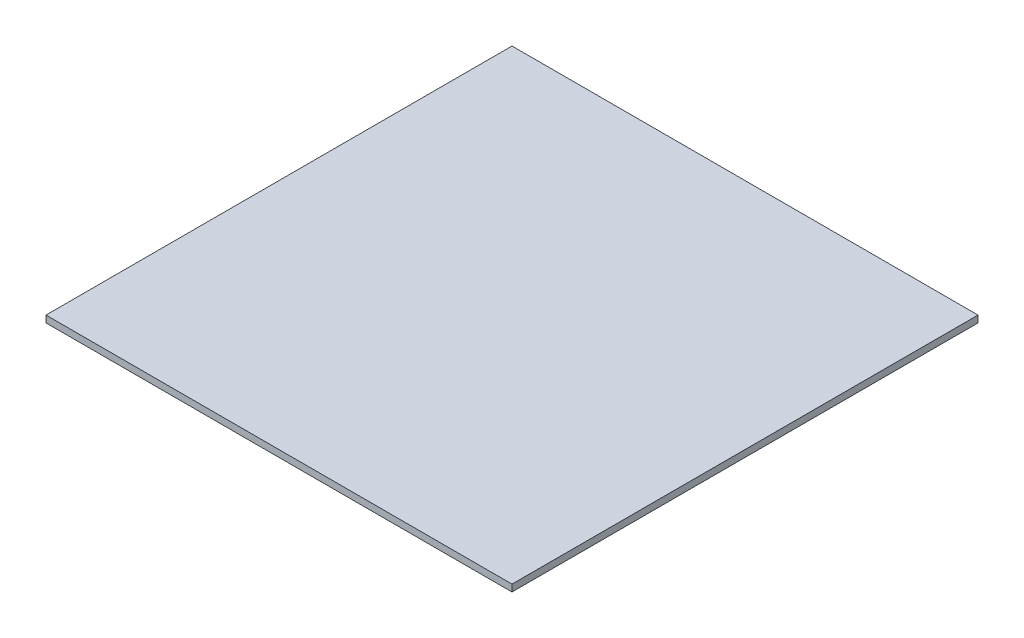
ISO-10303-21;
HEADER;
FILE_DESCRIPTION(('STEP AP214'),'2;1');
FILE_NAME('part.step','',(''),(''),'','','');
FILE_SCHEMA(('AUTOMOTIVE_DESIGN { 1 0 10303 214 1 1 1 1 }'));
ENDSEC;
DATA;
#1=APPLICATION_CONTEXT('core data for automotive mechanical design processes');
#2=APPLICATION_PROTOCOL_DEFINITION('international standard','automotive_design',2000,#1);
#3=PRODUCT_CONTEXT('',#1,'mechanical');
#4=PRODUCT('Part','Part','',(#3));
#5=PRODUCT_RELATED_PRODUCT_CATEGORY('part','',(#4));
#6=PRODUCT_DEFINITION_FORMATION('','',#4);
#7=PRODUCT_DEFINITION_CONTEXT('part definition',#1,'design');
#8=PRODUCT_DEFINITION('design','',#6,#7);
#9=PRODUCT_DEFINITION_SHAPE('','',#8);
#10=(LENGTH_UNIT() NAMED_UNIT(*) SI_UNIT(.MILLI.,.METRE.));
#11=(NAMED_UNIT(*) PLANE_ANGLE_UNIT() SI_UNIT($,.RADIAN.));
#12=(NAMED_UNIT(*) SI_UNIT($,.STERADIAN.) SOLID_ANGLE_UNIT());
#13=UNCERTAINTY_MEASURE_WITH_UNIT(LENGTH_MEASURE(1.E-05),#10,'distance_accuracy_value','');
#14=(GEOMETRIC_REPRESENTATION_CONTEXT(3) GLOBAL_UNCERTAINTY_ASSIGNED_CONTEXT((#13)) GLOBAL_UNIT_ASSIGNED_CONTEXT((#10,
#11,#12)) REPRESENTATION_CONTEXT('',''));
#15=CARTESIAN_POINT('',(0.,0.,0.));
#16=DIRECTION('',(0.,0.,1.));
#17=DIRECTION('',(1.,0.,0.));
#18=AXIS2_PLACEMENT_3D('',#15,#16,#17);
#19=CARTESIAN_POINT('',(37.5,1.1,37.5));
#20=DIRECTION('',(-1.,0.,0.));
#21=DIRECTION('',(0.,0.,1.));
#22=AXIS2_PLACEMENT_3D('',#19,#20,#21);
#23=PLANE('',#22);
#24=DIRECTION('',(0.,0.,-1.));
#25=VECTOR('',#24,1.);
#26=CARTESIAN_POINT('',(37.5,0.,37.5));
#27=LINE('',#26,#25);
#28=CARTESIAN_POINT('',(37.5,0.,37.5));
#29=VERTEX_POINT('',#28);
#30=CARTESIAN_POINT('',(37.5,0.,-37.5));
#31=VERTEX_POINT('',#30);
#32=EDGE_CURVE('E99',#29,#31,#27,.T.);
#33=ORIENTED_EDGE('',*,*,#32,.T.);
#34=DIRECTION('',(0.,-1.,0.));
#35=VECTOR('',#34,1.);
#36=CARTESIAN_POINT('',(37.5,1.1,-37.5));
#37=LINE('',#36,#35);
#38=CARTESIAN_POINT('',(37.5,1.1,-37.5));
#39=VERTEX_POINT('',#38);
#40=EDGE_CURVE('E11',#39,#31,#37,.T.);
#41=ORIENTED_EDGE('',*,*,#40,.F.);
#42=DIRECTION('',(0.,0.,-1.));
#43=VECTOR('',#42,1.);
#44=CARTESIAN_POINT('',(37.5,1.1,37.5));
#45=LINE('',#44,#43);
#46=CARTESIAN_POINT('',(37.5,1.1,37.5));
#47=VERTEX_POINT('',#46);
#48=EDGE_CURVE('E87',#47,#39,#45,.T.);
#49=ORIENTED_EDGE('',*,*,#48,.F.);
#50=DIRECTION('',(0.,-1.,0.));
#51=VECTOR('',#50,1.);
#52=CARTESIAN_POINT('',(37.5,1.1,37.5));
#53=LINE('',#52,#51);
#54=EDGE_CURVE('E95',#47,#29,#53,.T.);
#55=ORIENTED_EDGE('',*,*,#54,.T.);
#56=EDGE_LOOP('',(#33,#41,#49,#55));
#57=FACE_BOUND('',#56,.T.);
#58=ADVANCED_FACE('F36',(#57),#23,.F.);
#59=CARTESIAN_POINT('',(-37.5,1.1,-37.5));
#60=DIRECTION('',(0.,0.,1.));
#61=DIRECTION('',(1.,0.,0.));
#62=AXIS2_PLACEMENT_3D('',#59,#60,#61);
#63=PLANE('',#62);
#64=DIRECTION('',(-1.,0.,0.));
#65=VECTOR('',#64,1.);
#66=CARTESIAN_POINT('',(-37.5,0.,-37.5));
#67=LINE('',#66,#65);
#68=CARTESIAN_POINT('',(-37.5,0.,-37.5));
#69=VERTEX_POINT('',#68);
#70=EDGE_CURVE('E91',#31,#69,#67,.T.);
#71=ORIENTED_EDGE('',*,*,#70,.T.);
#72=DIRECTION('',(0.,-1.,0.));
#73=VECTOR('',#72,1.);
#74=CARTESIAN_POINT('',(-37.5,1.1,-37.5));
#75=LINE('',#74,#73);
#76=CARTESIAN_POINT('',(-37.5,1.1,-37.5));
#77=VERTEX_POINT('',#76);
#78=EDGE_CURVE('E44',#77,#69,#75,.T.);
#79=ORIENTED_EDGE('',*,*,#78,.F.);
#80=DIRECTION('',(-1.,0.,0.));
#81=VECTOR('',#80,1.);
#82=CARTESIAN_POINT('',(-37.5,1.1,-37.5));
#83=LINE('',#82,#81);
#84=EDGE_CURVE('E82',#39,#77,#83,.T.);
#85=ORIENTED_EDGE('',*,*,#84,.F.);
#86=ORIENTED_EDGE('',*,*,#40,.T.);
#87=EDGE_LOOP('',(#71,#79,#85,#86));
#88=FACE_BOUND('',#87,.T.);
#89=ADVANCED_FACE('F90',(#88),#63,.F.);
#90=CARTESIAN_POINT('',(-37.5,1.1,37.5));
#91=DIRECTION('',(1.,0.,0.));
#92=DIRECTION('',(0.,0.,-1.));
#93=AXIS2_PLACEMENT_3D('',#90,#91,#92);
#94=PLANE('',#93);
#95=DIRECTION('',(0.,0.,1.));
#96=VECTOR('',#95,1.);
#97=CARTESIAN_POINT('',(-37.5,0.,37.5));
#98=LINE('',#97,#96);
#99=CARTESIAN_POINT('',(-37.5,0.,37.5));
#100=VERTEX_POINT('',#99);
#101=EDGE_CURVE('E69',#69,#100,#98,.T.);
#102=ORIENTED_EDGE('',*,*,#101,.T.);
#103=DIRECTION('',(0.,-1.,0.));
#104=VECTOR('',#103,1.);
#105=CARTESIAN_POINT('',(-37.5,1.1,37.5));
#106=LINE('',#105,#104);
#107=CARTESIAN_POINT('',(-37.5,1.1,37.5));
#108=VERTEX_POINT('',#107);
#109=EDGE_CURVE('E92',#108,#100,#106,.T.);
#110=ORIENTED_EDGE('',*,*,#109,.F.);
#111=DIRECTION('',(0.,0.,1.));
#112=VECTOR('',#111,1.);
#113=CARTESIAN_POINT('',(-37.5,1.1,37.5));
#114=LINE('',#113,#112);
#115=EDGE_CURVE('E85',#77,#108,#114,.T.);
#116=ORIENTED_EDGE('',*,*,#115,.F.);
#117=ORIENTED_EDGE('',*,*,#78,.T.);
#118=EDGE_LOOP('',(#102,#110,#116,#117));
#119=FACE_BOUND('',#118,.T.);
#120=ADVANCED_FACE('F93',(#119),#94,.F.);
#121=CARTESIAN_POINT('',(-37.5,1.1,37.5));
#122=DIRECTION('',(0.,0.,-1.));
#123=DIRECTION('',(-1.,0.,0.));
#124=AXIS2_PLACEMENT_3D('',#121,#122,#123);
#125=PLANE('',#124);
#126=DIRECTION('',(1.,0.,0.));
#127=VECTOR('',#126,1.);
#128=CARTESIAN_POINT('',(-37.5,0.,37.5));
#129=LINE('',#128,#127);
#130=EDGE_CURVE('E75',#100,#29,#129,.T.);
#131=ORIENTED_EDGE('',*,*,#130,.T.);
#132=ORIENTED_EDGE('',*,*,#54,.F.);
#133=DIRECTION('',(1.,0.,0.));
#134=VECTOR('',#133,1.);
#135=CARTESIAN_POINT('',(-37.5,1.1,37.5));
#136=LINE('',#135,#134);
#137=EDGE_CURVE('E52',#108,#47,#136,.T.);
#138=ORIENTED_EDGE('',*,*,#137,.F.);
#139=ORIENTED_EDGE('',*,*,#109,.T.);
#140=EDGE_LOOP('',(#131,#132,#138,#139));
#141=FACE_BOUND('',#140,.T.);
#142=ADVANCED_FACE('F106',(#141),#125,.F.);
#143=CARTESIAN_POINT('',(0.,1.1,0.));
#144=DIRECTION('',(0.,-1.,0.));
#145=DIRECTION('',(0.,0.,-1.));
#146=AXIS2_PLACEMENT_3D('',#143,#144,#145);
#147=PLANE('',#146);
#148=ORIENTED_EDGE('',*,*,#48,.T.);
#149=ORIENTED_EDGE('',*,*,#84,.T.);
#150=ORIENTED_EDGE('',*,*,#115,.T.);
#151=ORIENTED_EDGE('',*,*,#137,.T.);
#152=EDGE_LOOP('',(#148,#149,#150,#151));
#153=FACE_BOUND('',#152,.T.);
#154=ADVANCED_FACE('F83',(#153),#147,.F.);
#155=CARTESIAN_POINT('',(0.,0.,0.));
#156=DIRECTION('',(0.,-1.,0.));
#157=DIRECTION('',(0.,0.,-1.));
#158=AXIS2_PLACEMENT_3D('',#155,#156,#157);
#159=PLANE('',#158);
#160=ORIENTED_EDGE('',*,*,#32,.F.);
#161=ORIENTED_EDGE('',*,*,#130,.F.);
#162=ORIENTED_EDGE('',*,*,#101,.F.);
#163=ORIENTED_EDGE('',*,*,#70,.F.);
#164=EDGE_LOOP('',(#160,#161,#162,#163));
#165=FACE_BOUND('',#164,.T.);
#166=ADVANCED_FACE('F109',(#165),#159,.T.);
#167=CLOSED_SHELL('',(#58,#89,#120,#142,#154,#166));
#168=MANIFOLD_SOLID_BREP('B2',#167);
#169=ADVANCED_BREP_SHAPE_REPRESENTATION('',(#18,#168),#14);
#170=SHAPE_DEFINITION_REPRESENTATION(#9,#169);
ENDSEC;
END-ISO-10303-21;
